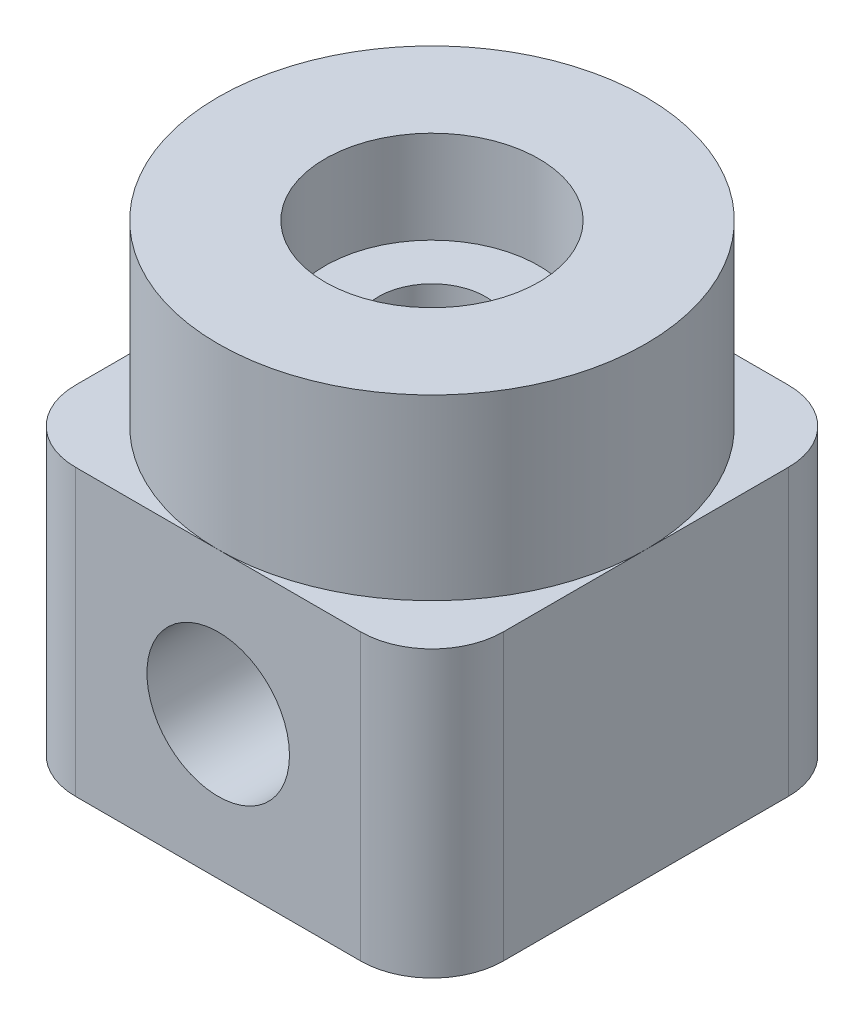
ISO-10303-21;
HEADER;
FILE_DESCRIPTION(('STEP AP214'),'2;1');
FILE_NAME('part.step','',(''),(''),'','','');
FILE_SCHEMA(('AUTOMOTIVE_DESIGN { 1 0 10303 214 1 1 1 1 }'));
ENDSEC;
DATA;
#1=APPLICATION_CONTEXT('core data for automotive mechanical design processes');
#2=APPLICATION_PROTOCOL_DEFINITION('international standard','automotive_design',2000,#1);
#3=PRODUCT_CONTEXT('',#1,'mechanical');
#4=PRODUCT('Part','Part','',(#3));
#5=PRODUCT_RELATED_PRODUCT_CATEGORY('part','',(#4));
#6=PRODUCT_DEFINITION_FORMATION('','',#4);
#7=PRODUCT_DEFINITION_CONTEXT('part definition',#1,'design');
#8=PRODUCT_DEFINITION('design','',#6,#7);
#9=PRODUCT_DEFINITION_SHAPE('','',#8);
#10=(LENGTH_UNIT() NAMED_UNIT(*) SI_UNIT(.MILLI.,.METRE.));
#11=(NAMED_UNIT(*) PLANE_ANGLE_UNIT() SI_UNIT($,.RADIAN.));
#12=(NAMED_UNIT(*) SI_UNIT($,.STERADIAN.) SOLID_ANGLE_UNIT());
#13=UNCERTAINTY_MEASURE_WITH_UNIT(LENGTH_MEASURE(1.E-05),#10,'distance_accuracy_value','');
#14=(GEOMETRIC_REPRESENTATION_CONTEXT(3) GLOBAL_UNCERTAINTY_ASSIGNED_CONTEXT((#13)) GLOBAL_UNIT_ASSIGNED_CONTEXT((#10,
#11,#12)) REPRESENTATION_CONTEXT('',''));
#15=CARTESIAN_POINT('',(0.,0.,0.));
#16=DIRECTION('',(0.,0.,1.));
#17=DIRECTION('',(1.,0.,0.));
#18=AXIS2_PLACEMENT_3D('',#15,#16,#17);
#19=CARTESIAN_POINT('',(0.,5.,0.));
#20=DIRECTION('',(0.,-1.,0.));
#21=DIRECTION('',(0.,0.,-1.));
#22=AXIS2_PLACEMENT_3D('',#19,#20,#21);
#23=CYLINDRICAL_SURFACE('',#22,6.);
#24=CARTESIAN_POINT('',(0.,5.,0.));
#25=DIRECTION('',(0.,1.,0.));
#26=DIRECTION('',(0.,0.,1.));
#27=AXIS2_PLACEMENT_3D('',#24,#25,#26);
#28=CIRCLE('',#27,6.);
#29=CARTESIAN_POINT('',(0.,5.,6.));
#30=VERTEX_POINT('',#29);
#31=EDGE_CURVE('E146',#30,#30,#28,.T.);
#32=ORIENTED_EDGE('',*,*,#31,.F.);
#33=EDGE_LOOP('',(#32));
#34=FACE_BOUND('',#33,.T.);
#35=CARTESIAN_POINT('',(0.,0.,0.));
#36=DIRECTION('',(0.,1.,0.));
#37=DIRECTION('',(0.,0.,1.));
#38=AXIS2_PLACEMENT_3D('',#35,#36,#37);
#39=CIRCLE('',#38,6.);
#40=CARTESIAN_POINT('',(6.,0.,0.));
#41=VERTEX_POINT('',#40);
#42=CARTESIAN_POINT('',(0.,0.,-6.));
#43=VERTEX_POINT('',#42);
#44=EDGE_CURVE('E139',#41,#43,#39,.T.);
#45=ORIENTED_EDGE('',*,*,#44,.T.);
#46=CARTESIAN_POINT('',(-6.,0.,0.));
#47=VERTEX_POINT('',#46);
#48=EDGE_CURVE('E147',#43,#47,#39,.T.);
#49=ORIENTED_EDGE('',*,*,#48,.T.);
#50=CARTESIAN_POINT('',(0.,0.,6.));
#51=VERTEX_POINT('',#50);
#52=EDGE_CURVE('E149',#47,#51,#39,.T.);
#53=ORIENTED_EDGE('',*,*,#52,.T.);
#54=CARTESIAN_POINT('',(0.,0.,0.));
#55=DIRECTION('',(0.,-1.,0.));
#56=DIRECTION('',(1.,0.,0.));
#57=AXIS2_PLACEMENT_3D('',#54,#55,#56);
#58=CIRCLE('',#57,6.);
#59=EDGE_CURVE('E122',#41,#51,#58,.T.);
#60=ORIENTED_EDGE('',*,*,#59,.F.);
#61=EDGE_LOOP('',(#45,#49,#53,#60));
#62=FACE_BOUND('',#61,.T.);
#63=ADVANCED_FACE('F39',(#34,#62),#23,.T.);
#64=CARTESIAN_POINT('',(0.,5.,0.));
#65=DIRECTION('',(0.,1.,0.));
#66=DIRECTION('',(0.,0.,1.));
#67=AXIS2_PLACEMENT_3D('',#64,#65,#66);
#68=PLANE('',#67);
#69=CARTESIAN_POINT('',(0.,5.,0.));
#70=DIRECTION('',(0.,1.,0.));
#71=DIRECTION('',(0.,0.,1.));
#72=AXIS2_PLACEMENT_3D('',#69,#70,#71);
#73=CIRCLE('',#72,3.);
#74=CARTESIAN_POINT('',(0.,5.,3.));
#75=VERTEX_POINT('',#74);
#76=EDGE_CURVE('E218',#75,#75,#73,.T.);
#77=ORIENTED_EDGE('',*,*,#76,.F.);
#78=EDGE_LOOP('',(#77));
#79=FACE_BOUND('',#78,.T.);
#80=ORIENTED_EDGE('',*,*,#31,.T.);
#81=EDGE_LOOP('',(#80));
#82=FACE_BOUND('',#81,.T.);
#83=ADVANCED_FACE('F244',(#79,#82),#68,.T.);
#84=CARTESIAN_POINT('',(6.,0.,-6.));
#85=DIRECTION('',(0.,1.,0.));
#86=DIRECTION('',(-1.,0.,0.));
#87=AXIS2_PLACEMENT_3D('',#84,#85,#86);
#88=PLANE('',#87);
#89=DIRECTION('',(0.,0.,1.));
#90=VECTOR('',#89,1.);
#91=CARTESIAN_POINT('',(6.,0.,-6.));
#92=LINE('',#91,#90);
#93=CARTESIAN_POINT('',(6.,0.,-4.));
#94=VERTEX_POINT('',#93);
#95=EDGE_CURVE('E128',#94,#41,#92,.T.);
#96=ORIENTED_EDGE('',*,*,#95,.F.);
#97=CARTESIAN_POINT('',(4.,0.,-4.));
#98=DIRECTION('',(0.,1.,0.));
#99=DIRECTION('',(-1.,0.,0.));
#100=AXIS2_PLACEMENT_3D('',#97,#98,#99);
#101=CIRCLE('',#100,2.);
#102=CARTESIAN_POINT('',(4.,0.,-6.));
#103=VERTEX_POINT('',#102);
#104=EDGE_CURVE('E190',#94,#103,#101,.T.);
#105=ORIENTED_EDGE('',*,*,#104,.T.);
#106=DIRECTION('',(-1.,0.,0.));
#107=VECTOR('',#106,1.);
#108=CARTESIAN_POINT('',(6.,0.,-6.));
#109=LINE('',#108,#107);
#110=EDGE_CURVE('E142',#103,#43,#109,.T.);
#111=ORIENTED_EDGE('',*,*,#110,.T.);
#112=ORIENTED_EDGE('',*,*,#44,.F.);
#113=EDGE_LOOP('',(#96,#105,#111,#112));
#114=FACE_BOUND('',#113,.T.);
#115=ADVANCED_FACE('F140',(#114),#88,.T.);
#116=CARTESIAN_POINT('',(-4.,0.,-6.));
#117=VERTEX_POINT('',#116);
#118=EDGE_CURVE('E155',#43,#117,#109,.T.);
#119=ORIENTED_EDGE('',*,*,#118,.T.);
#120=CARTESIAN_POINT('',(-4.,0.,-4.));
#121=DIRECTION('',(0.,1.,0.));
#122=DIRECTION('',(-1.,0.,0.));
#123=AXIS2_PLACEMENT_3D('',#120,#121,#122);
#124=CIRCLE('',#123,2.);
#125=CARTESIAN_POINT('',(-6.,0.,-4.));
#126=VERTEX_POINT('',#125);
#127=EDGE_CURVE('E185',#117,#126,#124,.T.);
#128=ORIENTED_EDGE('',*,*,#127,.T.);
#129=DIRECTION('',(0.,0.,1.));
#130=VECTOR('',#129,1.);
#131=CARTESIAN_POINT('',(-6.,0.,-6.));
#132=LINE('',#131,#130);
#133=EDGE_CURVE('E135',#126,#47,#132,.T.);
#134=ORIENTED_EDGE('',*,*,#133,.T.);
#135=ORIENTED_EDGE('',*,*,#48,.F.);
#136=EDGE_LOOP('',(#119,#128,#134,#135));
#137=FACE_BOUND('',#136,.T.);
#138=ADVANCED_FACE('F282',(#137),#88,.T.);
#139=CARTESIAN_POINT('',(-6.,0.,-6.));
#140=DIRECTION('',(-1.,0.,0.));
#141=DIRECTION('',(0.,0.,1.));
#142=AXIS2_PLACEMENT_3D('',#139,#140,#141);
#143=PLANE('',#142);
#144=ORIENTED_EDGE('',*,*,#133,.F.);
#145=DIRECTION('',(0.,-1.,0.));
#146=VECTOR('',#145,1.);
#147=CARTESIAN_POINT('',(-6.,-8.,-4.));
#148=LINE('',#147,#146);
#149=CARTESIAN_POINT('',(-6.,-8.,-4.));
#150=VERTEX_POINT('',#149);
#151=EDGE_CURVE('E170',#126,#150,#148,.T.);
#152=ORIENTED_EDGE('',*,*,#151,.T.);
#153=DIRECTION('',(0.,0.,1.));
#154=VECTOR('',#153,1.);
#155=CARTESIAN_POINT('',(-6.,-8.,-6.));
#156=LINE('',#155,#154);
#157=CARTESIAN_POINT('',(-6.,-8.,4.));
#158=VERTEX_POINT('',#157);
#159=EDGE_CURVE('E160',#150,#158,#156,.T.);
#160=ORIENTED_EDGE('',*,*,#159,.T.);
#161=DIRECTION('',(0.,-1.,0.));
#162=VECTOR('',#161,1.);
#163=CARTESIAN_POINT('',(-6.,0.,4.));
#164=LINE('',#163,#162);
#165=CARTESIAN_POINT('',(-6.,0.,4.));
#166=VERTEX_POINT('',#165);
#167=EDGE_CURVE('E167',#158,#166,#164,.F.);
#168=ORIENTED_EDGE('',*,*,#167,.T.);
#169=DIRECTION('',(0.,0.,-1.));
#170=VECTOR('',#169,1.);
#171=CARTESIAN_POINT('',(-6.,0.,6.));
#172=LINE('',#171,#170);
#173=EDGE_CURVE('E124',#166,#47,#172,.T.);
#174=ORIENTED_EDGE('',*,*,#173,.T.);
#175=EDGE_LOOP('',(#144,#152,#160,#168,#174));
#176=FACE_BOUND('',#175,.T.);
#177=ADVANCED_FACE('F286',(#176),#143,.T.);
#178=CARTESIAN_POINT('',(6.00000000000001,-8.,-6.));
#179=DIRECTION('',(1.,0.,0.));
#180=DIRECTION('',(0.,1.,0.));
#181=AXIS2_PLACEMENT_3D('',#178,#179,#180);
#182=PLANE('',#181);
#183=DIRECTION('',(0.,0.,1.));
#184=VECTOR('',#183,1.);
#185=CARTESIAN_POINT('',(6.00000000000001,-8.,-6.));
#186=LINE('',#185,#184);
#187=CARTESIAN_POINT('',(6.00000000000001,-8.,-4.));
#188=VERTEX_POINT('',#187);
#189=CARTESIAN_POINT('',(6.00000000000001,-8.,4.));
#190=VERTEX_POINT('',#189);
#191=EDGE_CURVE('E136',#188,#190,#186,.T.);
#192=ORIENTED_EDGE('',*,*,#191,.F.);
#193=DIRECTION('',(0.,1.,0.));
#194=VECTOR('',#193,1.);
#195=CARTESIAN_POINT('',(6.,0.,-4.));
#196=LINE('',#195,#194);
#197=EDGE_CURVE('E133',#188,#94,#196,.T.);
#198=ORIENTED_EDGE('',*,*,#197,.T.);
#199=ORIENTED_EDGE('',*,*,#95,.T.);
#200=DIRECTION('',(0.,0.,-1.));
#201=VECTOR('',#200,1.);
#202=CARTESIAN_POINT('',(6.,0.,6.));
#203=LINE('',#202,#201);
#204=CARTESIAN_POINT('',(6.,0.,4.));
#205=VERTEX_POINT('',#204);
#206=EDGE_CURVE('E117',#205,#41,#203,.T.);
#207=ORIENTED_EDGE('',*,*,#206,.F.);
#208=DIRECTION('',(0.,1.,0.));
#209=VECTOR('',#208,1.);
#210=CARTESIAN_POINT('',(6.00000000000001,-8.,4.));
#211=LINE('',#210,#209);
#212=EDGE_CURVE('E187',#205,#190,#211,.F.);
#213=ORIENTED_EDGE('',*,*,#212,.T.);
#214=EDGE_LOOP('',(#192,#198,#199,#207,#213));
#215=FACE_BOUND('',#214,.T.);
#216=ADVANCED_FACE('F131',(#215),#182,.T.);
#217=CARTESIAN_POINT('',(-6.,-8.,-6.));
#218=DIRECTION('',(0.,-1.,0.));
#219=DIRECTION('',(1.,0.,0.));
#220=AXIS2_PLACEMENT_3D('',#217,#218,#219);
#221=PLANE('',#220);
#222=ORIENTED_EDGE('',*,*,#159,.F.);
#223=CARTESIAN_POINT('',(-4.,-8.,-4.));
#224=DIRECTION('',(0.,-1.,0.));
#225=DIRECTION('',(1.,0.,0.));
#226=AXIS2_PLACEMENT_3D('',#223,#224,#225);
#227=CIRCLE('',#226,2.);
#228=CARTESIAN_POINT('',(-4.,-8.,-6.));
#229=VERTEX_POINT('',#228);
#230=EDGE_CURVE('E179',#150,#229,#227,.T.);
#231=ORIENTED_EDGE('',*,*,#230,.T.);
#232=DIRECTION('',(1.,0.,0.));
#233=VECTOR('',#232,1.);
#234=CARTESIAN_POINT('',(-6.,-8.,-6.));
#235=LINE('',#234,#233);
#236=CARTESIAN_POINT('',(4.00000000000001,-8.,-6.));
#237=VERTEX_POINT('',#236);
#238=EDGE_CURVE('E152',#229,#237,#235,.T.);
#239=ORIENTED_EDGE('',*,*,#238,.T.);
#240=CARTESIAN_POINT('',(4.00000000000001,-8.,-4.));
#241=DIRECTION('',(0.,-1.,0.));
#242=DIRECTION('',(1.,0.,0.));
#243=AXIS2_PLACEMENT_3D('',#240,#241,#242);
#244=CIRCLE('',#243,2.);
#245=EDGE_CURVE('E177',#237,#188,#244,.T.);
#246=ORIENTED_EDGE('',*,*,#245,.T.);
#247=ORIENTED_EDGE('',*,*,#191,.T.);
#248=CARTESIAN_POINT('',(4.00000000000001,-8.,4.));
#249=DIRECTION('',(0.,-1.,0.));
#250=DIRECTION('',(1.,0.,0.));
#251=AXIS2_PLACEMENT_3D('',#248,#249,#250);
#252=CIRCLE('',#251,2.);
#253=CARTESIAN_POINT('',(4.00000000000001,-8.,6.));
#254=VERTEX_POINT('',#253);
#255=EDGE_CURVE('E175',#190,#254,#252,.T.);
#256=ORIENTED_EDGE('',*,*,#255,.T.);
#257=DIRECTION('',(1.,0.,0.));
#258=VECTOR('',#257,1.);
#259=CARTESIAN_POINT('',(-6.,-8.,6.));
#260=LINE('',#259,#258);
#261=CARTESIAN_POINT('',(-4.,-8.,6.));
#262=VERTEX_POINT('',#261);
#263=EDGE_CURVE('E202',#262,#254,#260,.T.);
#264=ORIENTED_EDGE('',*,*,#263,.F.);
#265=CARTESIAN_POINT('',(-4.,-8.,4.));
#266=DIRECTION('',(0.,-1.,0.));
#267=DIRECTION('',(1.,0.,0.));
#268=AXIS2_PLACEMENT_3D('',#265,#266,#267);
#269=CIRCLE('',#268,2.);
#270=EDGE_CURVE('E173',#262,#158,#269,.T.);
#271=ORIENTED_EDGE('',*,*,#270,.T.);
#272=EDGE_LOOP('',(#222,#231,#239,#246,#247,#256,#264,#271));
#273=FACE_BOUND('',#272,.T.);
#274=ADVANCED_FACE('F271',(#273),#221,.T.);
#275=CARTESIAN_POINT('',(0.,0.,-6.));
#276=DIRECTION('',(0.,0.,1.));
#277=DIRECTION('',(1.,0.,0.));
#278=AXIS2_PLACEMENT_3D('',#275,#276,#277);
#279=PLANE('',#278);
#280=CARTESIAN_POINT('',(0.,-4.,-6.));
#281=DIRECTION('',(0.,0.,1.));
#282=DIRECTION('',(1.,0.,0.));
#283=AXIS2_PLACEMENT_3D('',#280,#281,#282);
#284=CIRCLE('',#283,2.);
#285=CARTESIAN_POINT('',(2.,-4.,-6.));
#286=VERTEX_POINT('',#285);
#287=EDGE_CURVE('E209',#286,#286,#284,.T.);
#288=ORIENTED_EDGE('',*,*,#287,.T.);
#289=EDGE_LOOP('',(#288));
#290=FACE_BOUND('',#289,.T.);
#291=ORIENTED_EDGE('',*,*,#238,.F.);
#292=DIRECTION('',(0.,-1.,0.));
#293=VECTOR('',#292,1.);
#294=CARTESIAN_POINT('',(-4.,0.,-6.));
#295=LINE('',#294,#293);
#296=EDGE_CURVE('E183',#229,#117,#295,.F.);
#297=ORIENTED_EDGE('',*,*,#296,.T.);
#298=ORIENTED_EDGE('',*,*,#118,.F.);
#299=ORIENTED_EDGE('',*,*,#110,.F.);
#300=DIRECTION('',(0.,1.,0.));
#301=VECTOR('',#300,1.);
#302=CARTESIAN_POINT('',(4.00000000000001,-8.,-6.));
#303=LINE('',#302,#301);
#304=EDGE_CURVE('E181',#103,#237,#303,.F.);
#305=ORIENTED_EDGE('',*,*,#304,.T.);
#306=EDGE_LOOP('',(#291,#297,#298,#299,#305));
#307=FACE_BOUND('',#306,.T.);
#308=ADVANCED_FACE('F277',(#290,#307),#279,.F.);
#309=CARTESIAN_POINT('',(6.,0.,6.));
#310=DIRECTION('',(0.,-1.,0.));
#311=DIRECTION('',(1.,0.,0.));
#312=AXIS2_PLACEMENT_3D('',#309,#310,#311);
#313=PLANE('',#312);
#314=DIRECTION('',(-1.,0.,0.));
#315=VECTOR('',#314,1.);
#316=CARTESIAN_POINT('',(6.,0.,6.));
#317=LINE('',#316,#315);
#318=CARTESIAN_POINT('',(4.,0.,6.));
#319=VERTEX_POINT('',#318);
#320=EDGE_CURVE('E200',#319,#51,#317,.T.);
#321=ORIENTED_EDGE('',*,*,#320,.F.);
#322=CARTESIAN_POINT('',(4.,0.,4.));
#323=DIRECTION('',(0.,-1.,0.));
#324=DIRECTION('',(1.,0.,0.));
#325=AXIS2_PLACEMENT_3D('',#322,#323,#324);
#326=CIRCLE('',#325,2.);
#327=EDGE_CURVE('E48',#319,#205,#326,.F.);
#328=ORIENTED_EDGE('',*,*,#327,.T.);
#329=ORIENTED_EDGE('',*,*,#206,.T.);
#330=ORIENTED_EDGE('',*,*,#59,.T.);
#331=EDGE_LOOP('',(#321,#328,#329,#330));
#332=FACE_BOUND('',#331,.T.);
#333=ADVANCED_FACE('F120',(#332),#313,.F.);
#334=ORIENTED_EDGE('',*,*,#173,.F.);
#335=CARTESIAN_POINT('',(-4.,0.,4.));
#336=DIRECTION('',(0.,-1.,0.));
#337=DIRECTION('',(1.,0.,0.));
#338=AXIS2_PLACEMENT_3D('',#335,#336,#337);
#339=CIRCLE('',#338,2.);
#340=CARTESIAN_POINT('',(-4.,0.,6.));
#341=VERTEX_POINT('',#340);
#342=EDGE_CURVE('E11',#166,#341,#339,.F.);
#343=ORIENTED_EDGE('',*,*,#342,.T.);
#344=EDGE_CURVE('E204',#51,#341,#317,.T.);
#345=ORIENTED_EDGE('',*,*,#344,.F.);
#346=ORIENTED_EDGE('',*,*,#52,.F.);
#347=EDGE_LOOP('',(#334,#343,#345,#346));
#348=FACE_BOUND('',#347,.T.);
#349=ADVANCED_FACE('F289',(#348),#313,.F.);
#350=CARTESIAN_POINT('',(0.,0.,6.));
#351=DIRECTION('',(0.,0.,1.));
#352=DIRECTION('',(1.,0.,0.));
#353=AXIS2_PLACEMENT_3D('',#350,#351,#352);
#354=PLANE('',#353);
#355=CARTESIAN_POINT('',(0.,-4.,6.));
#356=DIRECTION('',(0.,0.,1.));
#357=DIRECTION('',(1.,0.,0.));
#358=AXIS2_PLACEMENT_3D('',#355,#356,#357);
#359=CIRCLE('',#358,2.);
#360=CARTESIAN_POINT('',(2.,-4.,6.));
#361=VERTEX_POINT('',#360);
#362=EDGE_CURVE('E210',#361,#361,#359,.T.);
#363=ORIENTED_EDGE('',*,*,#362,.F.);
#364=EDGE_LOOP('',(#363));
#365=FACE_BOUND('',#364,.T.);
#366=ORIENTED_EDGE('',*,*,#263,.T.);
#367=DIRECTION('',(0.,1.,0.));
#368=VECTOR('',#367,1.);
#369=CARTESIAN_POINT('',(4.,0.,6.));
#370=LINE('',#369,#368);
#371=EDGE_CURVE('E195',#254,#319,#370,.T.);
#372=ORIENTED_EDGE('',*,*,#371,.T.);
#373=ORIENTED_EDGE('',*,*,#320,.T.);
#374=ORIENTED_EDGE('',*,*,#344,.T.);
#375=DIRECTION('',(0.,-1.,0.));
#376=VECTOR('',#375,1.);
#377=CARTESIAN_POINT('',(-4.,0.,6.));
#378=LINE('',#377,#376);
#379=EDGE_CURVE('E192',#341,#262,#378,.T.);
#380=ORIENTED_EDGE('',*,*,#379,.T.);
#381=EDGE_LOOP('',(#366,#372,#373,#374,#380));
#382=FACE_BOUND('',#381,.T.);
#383=ADVANCED_FACE('F199',(#365,#382),#354,.T.);
#384=CARTESIAN_POINT('',(0.,-4.,-6.));
#385=DIRECTION('',(0.,0.,1.));
#386=DIRECTION('',(1.,0.,0.));
#387=AXIS2_PLACEMENT_3D('',#384,#385,#386);
#388=CYLINDRICAL_SURFACE('',#387,2.);
#389=ORIENTED_EDGE('',*,*,#287,.F.);
#390=EDGE_LOOP('',(#389));
#391=FACE_BOUND('',#390,.T.);
#392=ORIENTED_EDGE('',*,*,#362,.T.);
#393=EDGE_LOOP('',(#392));
#394=FACE_BOUND('',#393,.T.);
#395=ADVANCED_FACE('F259',(#391,#394),#388,.F.);
#396=CARTESIAN_POINT('',(-4.,0.,-4.));
#397=DIRECTION('',(0.,1.,0.));
#398=DIRECTION('',(0.,0.,1.));
#399=AXIS2_PLACEMENT_3D('',#396,#397,#398);
#400=CYLINDRICAL_SURFACE('',#399,2.);
#401=ORIENTED_EDGE('',*,*,#127,.F.);
#402=ORIENTED_EDGE('',*,*,#296,.F.);
#403=ORIENTED_EDGE('',*,*,#230,.F.);
#404=ORIENTED_EDGE('',*,*,#151,.F.);
#405=EDGE_LOOP('',(#401,#402,#403,#404));
#406=FACE_BOUND('',#405,.T.);
#407=ADVANCED_FACE('F255',(#406),#400,.T.);
#408=CARTESIAN_POINT('',(4.00000000000001,-8.,-4.));
#409=DIRECTION('',(0.,-1.,0.));
#410=DIRECTION('',(1.,0.,0.));
#411=AXIS2_PLACEMENT_3D('',#408,#409,#410);
#412=CYLINDRICAL_SURFACE('',#411,2.);
#413=ORIENTED_EDGE('',*,*,#245,.F.);
#414=ORIENTED_EDGE('',*,*,#304,.F.);
#415=ORIENTED_EDGE('',*,*,#104,.F.);
#416=ORIENTED_EDGE('',*,*,#197,.F.);
#417=EDGE_LOOP('',(#413,#414,#415,#416));
#418=FACE_BOUND('',#417,.T.);
#419=ADVANCED_FACE('F258',(#418),#412,.T.);
#420=CARTESIAN_POINT('',(4.,0.,4.));
#421=DIRECTION('',(0.,1.,0.));
#422=DIRECTION('',(-1.,0.,0.));
#423=AXIS2_PLACEMENT_3D('',#420,#421,#422);
#424=CYLINDRICAL_SURFACE('',#423,2.);
#425=ORIENTED_EDGE('',*,*,#255,.F.);
#426=ORIENTED_EDGE('',*,*,#212,.F.);
#427=ORIENTED_EDGE('',*,*,#327,.F.);
#428=ORIENTED_EDGE('',*,*,#371,.F.);
#429=EDGE_LOOP('',(#425,#426,#427,#428));
#430=FACE_BOUND('',#429,.T.);
#431=ADVANCED_FACE('F262',(#430),#424,.T.);
#432=CARTESIAN_POINT('',(-4.,0.,4.));
#433=DIRECTION('',(0.,-1.,0.));
#434=DIRECTION('',(0.,0.,-1.));
#435=AXIS2_PLACEMENT_3D('',#432,#433,#434);
#436=CYLINDRICAL_SURFACE('',#435,2.);
#437=ORIENTED_EDGE('',*,*,#342,.F.);
#438=ORIENTED_EDGE('',*,*,#167,.F.);
#439=ORIENTED_EDGE('',*,*,#270,.F.);
#440=ORIENTED_EDGE('',*,*,#379,.F.);
#441=EDGE_LOOP('',(#437,#438,#439,#440));
#442=FACE_BOUND('',#441,.T.);
#443=ADVANCED_FACE('F41',(#442),#436,.T.);
#444=CARTESIAN_POINT('',(0.,2.4,0.));
#445=DIRECTION('',(0.,1.,0.));
#446=DIRECTION('',(0.,0.,1.));
#447=AXIS2_PLACEMENT_3D('',#444,#445,#446);
#448=PLANE('',#447);
#449=CARTESIAN_POINT('',(0.,2.4,0.));
#450=DIRECTION('',(0.,1.,0.));
#451=DIRECTION('',(0.,0.,1.));
#452=AXIS2_PLACEMENT_3D('',#449,#450,#451);
#453=CIRCLE('',#452,3.);
#454=CARTESIAN_POINT('',(0.,2.4,3.));
#455=VERTEX_POINT('',#454);
#456=EDGE_CURVE('E221',#455,#455,#453,.T.);
#457=ORIENTED_EDGE('',*,*,#456,.T.);
#458=EDGE_LOOP('',(#457));
#459=FACE_BOUND('',#458,.T.);
#460=CARTESIAN_POINT('',(0.,2.4,0.));
#461=DIRECTION('',(0.,1.,0.));
#462=DIRECTION('',(0.,0.,1.));
#463=AXIS2_PLACEMENT_3D('',#460,#461,#462);
#464=CIRCLE('',#463,1.5);
#465=CARTESIAN_POINT('',(0.,2.4,1.5));
#466=VERTEX_POINT('',#465);
#467=EDGE_CURVE('E43',#466,#466,#464,.F.);
#468=ORIENTED_EDGE('',*,*,#467,.T.);
#469=EDGE_LOOP('',(#468));
#470=FACE_BOUND('',#469,.T.);
#471=ADVANCED_FACE('F228',(#459,#470),#448,.T.);
#472=CARTESIAN_POINT('',(0.,2.4,0.));
#473=DIRECTION('',(0.,1.,0.));
#474=DIRECTION('',(0.,0.,1.));
#475=AXIS2_PLACEMENT_3D('',#472,#473,#474);
#476=CYLINDRICAL_SURFACE('',#475,3.);
#477=ORIENTED_EDGE('',*,*,#456,.F.);
#478=EDGE_LOOP('',(#477));
#479=FACE_BOUND('',#478,.T.);
#480=ORIENTED_EDGE('',*,*,#76,.T.);
#481=EDGE_LOOP('',(#480));
#482=FACE_BOUND('',#481,.T.);
#483=ADVANCED_FACE('F238',(#479,#482),#476,.F.);
#484=CARTESIAN_POINT('',(0.,0.,0.));
#485=DIRECTION('',(0.,1.,0.));
#486=DIRECTION('',(0.,0.,1.));
#487=AXIS2_PLACEMENT_3D('',#484,#485,#486);
#488=PLANE('',#487);
#489=CARTESIAN_POINT('',(0.,0.,0.));
#490=DIRECTION('',(0.,1.,0.));
#491=DIRECTION('',(0.,0.,1.));
#492=AXIS2_PLACEMENT_3D('',#489,#490,#491);
#493=CIRCLE('',#492,1.5);
#494=CARTESIAN_POINT('',(0.,0.,1.5));
#495=VERTEX_POINT('',#494);
#496=EDGE_CURVE('E213',#495,#495,#493,.T.);
#497=ORIENTED_EDGE('',*,*,#496,.T.);
#498=EDGE_LOOP('',(#497));
#499=FACE_BOUND('',#498,.T.);
#500=ADVANCED_FACE('F232',(#499),#488,.T.);
#501=CARTESIAN_POINT('',(0.,0.,0.));
#502=DIRECTION('',(0.,1.,0.));
#503=DIRECTION('',(0.,0.,1.));
#504=AXIS2_PLACEMENT_3D('',#501,#502,#503);
#505=CYLINDRICAL_SURFACE('',#504,1.5);
#506=ORIENTED_EDGE('',*,*,#496,.F.);
#507=EDGE_LOOP('',(#506));
#508=FACE_BOUND('',#507,.T.);
#509=ORIENTED_EDGE('',*,*,#467,.F.);
#510=EDGE_LOOP('',(#509));
#511=FACE_BOUND('',#510,.T.);
#512=ADVANCED_FACE('F230',(#508,#511),#505,.F.);
#513=CLOSED_SHELL('',(#63,#83,#115,#138,#177,#216,#274,#308,#333,#349,#383,#395,#407,#419,#431,
#443,#471,#483,#500,#512));
#514=MANIFOLD_SOLID_BREP('B2',#513);
#515=ADVANCED_BREP_SHAPE_REPRESENTATION('',(#18,#514),#14);
#516=SHAPE_DEFINITION_REPRESENTATION(#9,#515);
ENDSEC;
END-ISO-10303-21;
